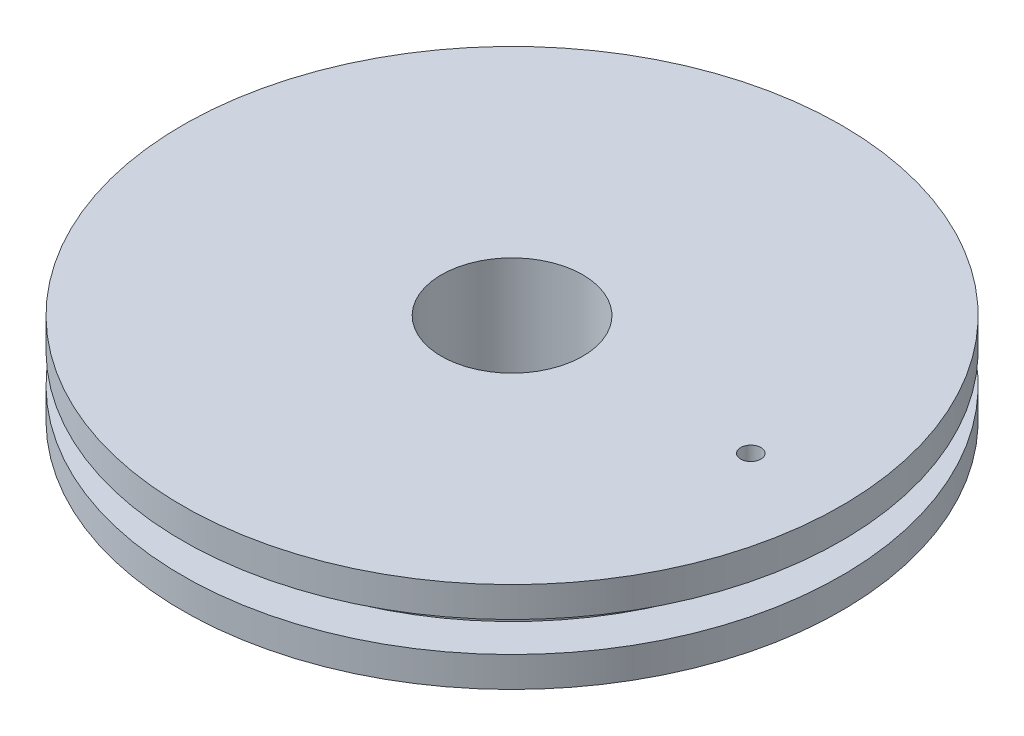
ISO-10303-21;
HEADER;
FILE_DESCRIPTION(('STEP AP214'),'2;1');
FILE_NAME('part.step','',(''),(''),'','','');
FILE_SCHEMA(('AUTOMOTIVE_DESIGN { 1 0 10303 214 1 1 1 1 }'));
ENDSEC;
DATA;
#1=APPLICATION_CONTEXT('core data for automotive mechanical design processes');
#2=APPLICATION_PROTOCOL_DEFINITION('international standard','automotive_design',2000,#1);
#3=PRODUCT_CONTEXT('',#1,'mechanical');
#4=PRODUCT('Part','Part','',(#3));
#5=PRODUCT_RELATED_PRODUCT_CATEGORY('part','',(#4));
#6=PRODUCT_DEFINITION_FORMATION('','',#4);
#7=PRODUCT_DEFINITION_CONTEXT('part definition',#1,'design');
#8=PRODUCT_DEFINITION('design','',#6,#7);
#9=PRODUCT_DEFINITION_SHAPE('','',#8);
#10=(LENGTH_UNIT() NAMED_UNIT(*) SI_UNIT(.MILLI.,.METRE.));
#11=(NAMED_UNIT(*) PLANE_ANGLE_UNIT() SI_UNIT($,.RADIAN.));
#12=(NAMED_UNIT(*) SI_UNIT($,.STERADIAN.) SOLID_ANGLE_UNIT());
#13=UNCERTAINTY_MEASURE_WITH_UNIT(LENGTH_MEASURE(1.E-05),#10,'distance_accuracy_value','');
#14=(GEOMETRIC_REPRESENTATION_CONTEXT(3) GLOBAL_UNCERTAINTY_ASSIGNED_CONTEXT((#13)) GLOBAL_UNIT_ASSIGNED_CONTEXT((#10,
#11,#12)) REPRESENTATION_CONTEXT('',''));
#15=CARTESIAN_POINT('',(0.,0.,0.));
#16=DIRECTION('',(0.,0.,1.));
#17=DIRECTION('',(1.,0.,0.));
#18=AXIS2_PLACEMENT_3D('',#15,#16,#17);
#19=CARTESIAN_POINT('',(0.,0.,0.));
#20=DIRECTION('',(0.,-1.,0.));
#21=DIRECTION('',(0.,0.,-1.));
#22=AXIS2_PLACEMENT_3D('',#19,#20,#21);
#23=CYLINDRICAL_SURFACE('',#22,32.65);
#24=CARTESIAN_POINT('',(0.,-1.5,0.));
#25=DIRECTION('',(0.,-1.,0.));
#26=DIRECTION('',(0.,0.,-1.));
#27=AXIS2_PLACEMENT_3D('',#24,#25,#26);
#28=CIRCLE('',#27,32.65);
#29=CARTESIAN_POINT('',(0.,-1.5,-32.65));
#30=VERTEX_POINT('',#29);
#31=EDGE_CURVE('E10',#30,#30,#28,.T.);
#32=ORIENTED_EDGE('',*,*,#31,.T.);
#33=EDGE_LOOP('',(#32));
#34=FACE_BOUND('',#33,.T.);
#35=CARTESIAN_POINT('',(0.,-4.5,0.));
#36=DIRECTION('',(0.,-1.,0.));
#37=DIRECTION('',(0.,0.,-1.));
#38=AXIS2_PLACEMENT_3D('',#35,#36,#37);
#39=CIRCLE('',#38,32.65);
#40=CARTESIAN_POINT('',(0.,-4.5,-32.65));
#41=VERTEX_POINT('',#40);
#42=EDGE_CURVE('E67',#41,#41,#39,.T.);
#43=ORIENTED_EDGE('',*,*,#42,.F.);
#44=EDGE_LOOP('',(#43));
#45=FACE_BOUND('',#44,.T.);
#46=ADVANCED_FACE('F33',(#34,#45),#23,.T.);
#47=CARTESIAN_POINT('',(32.65,-1.5,0.));
#48=DIRECTION('',(0.,1.,0.));
#49=DIRECTION('',(0.,0.,1.));
#50=AXIS2_PLACEMENT_3D('',#47,#48,#49);
#51=PLANE('',#50);
#52=CARTESIAN_POINT('',(0.,-1.5,0.));
#53=DIRECTION('',(0.,-1.,0.));
#54=DIRECTION('',(0.,0.,-1.));
#55=AXIS2_PLACEMENT_3D('',#52,#53,#54);
#56=CIRCLE('',#55,28.65);
#57=CARTESIAN_POINT('',(0.,-1.5,-28.65));
#58=VERTEX_POINT('',#57);
#59=EDGE_CURVE('E40',#58,#58,#56,.T.);
#60=ORIENTED_EDGE('',*,*,#59,.T.);
#61=EDGE_LOOP('',(#60));
#62=FACE_BOUND('',#61,.T.);
#63=ORIENTED_EDGE('',*,*,#31,.F.);
#64=EDGE_LOOP('',(#63));
#65=FACE_BOUND('',#64,.T.);
#66=ADVANCED_FACE('F127',(#62,#65),#51,.T.);
#67=CARTESIAN_POINT('',(0.,0.,0.));
#68=DIRECTION('',(0.,-1.,0.));
#69=DIRECTION('',(0.,0.,-1.));
#70=AXIS2_PLACEMENT_3D('',#67,#68,#69);
#71=CYLINDRICAL_SURFACE('',#70,28.65);
#72=CARTESIAN_POINT('',(0.,1.5,0.));
#73=DIRECTION('',(0.,-1.,0.));
#74=DIRECTION('',(0.,0.,-1.));
#75=AXIS2_PLACEMENT_3D('',#72,#73,#74);
#76=CIRCLE('',#75,28.65);
#77=CARTESIAN_POINT('',(0.,1.5,-28.65));
#78=VERTEX_POINT('',#77);
#79=EDGE_CURVE('E44',#78,#78,#76,.T.);
#80=ORIENTED_EDGE('',*,*,#79,.T.);
#81=EDGE_LOOP('',(#80));
#82=FACE_BOUND('',#81,.T.);
#83=ORIENTED_EDGE('',*,*,#59,.F.);
#84=EDGE_LOOP('',(#83));
#85=FACE_BOUND('',#84,.T.);
#86=ADVANCED_FACE('F121',(#82,#85),#71,.T.);
#87=CARTESIAN_POINT('',(32.65,1.5,0.));
#88=DIRECTION('',(0.,-1.,0.));
#89=DIRECTION('',(0.,0.,-1.));
#90=AXIS2_PLACEMENT_3D('',#87,#88,#89);
#91=PLANE('',#90);
#92=CARTESIAN_POINT('',(0.,1.5,0.));
#93=DIRECTION('',(0.,-1.,0.));
#94=DIRECTION('',(0.,0.,-1.));
#95=AXIS2_PLACEMENT_3D('',#92,#93,#94);
#96=CIRCLE('',#95,32.65);
#97=CARTESIAN_POINT('',(0.,1.5,-32.65));
#98=VERTEX_POINT('',#97);
#99=EDGE_CURVE('E49',#98,#98,#96,.T.);
#100=ORIENTED_EDGE('',*,*,#99,.T.);
#101=EDGE_LOOP('',(#100));
#102=FACE_BOUND('',#101,.T.);
#103=ORIENTED_EDGE('',*,*,#79,.F.);
#104=EDGE_LOOP('',(#103));
#105=FACE_BOUND('',#104,.T.);
#106=ADVANCED_FACE('F115',(#102,#105),#91,.T.);
#107=CARTESIAN_POINT('',(0.,0.,0.));
#108=DIRECTION('',(0.,-1.,0.));
#109=DIRECTION('',(0.,0.,-1.));
#110=AXIS2_PLACEMENT_3D('',#107,#108,#109);
#111=CYLINDRICAL_SURFACE('',#110,32.65);
#112=CARTESIAN_POINT('',(0.,4.5,0.));
#113=DIRECTION('',(0.,-1.,0.));
#114=DIRECTION('',(0.,0.,-1.));
#115=AXIS2_PLACEMENT_3D('',#112,#113,#114);
#116=CIRCLE('',#115,32.65);
#117=CARTESIAN_POINT('',(0.,4.5,-32.65));
#118=VERTEX_POINT('',#117);
#119=EDGE_CURVE('E52',#118,#118,#116,.T.);
#120=ORIENTED_EDGE('',*,*,#119,.T.);
#121=EDGE_LOOP('',(#120));
#122=FACE_BOUND('',#121,.T.);
#123=ORIENTED_EDGE('',*,*,#99,.F.);
#124=EDGE_LOOP('',(#123));
#125=FACE_BOUND('',#124,.T.);
#126=ADVANCED_FACE('F108',(#122,#125),#111,.T.);
#127=CARTESIAN_POINT('',(7.,4.5,0.));
#128=DIRECTION('',(0.,1.,0.));
#129=DIRECTION('',(0.,0.,1.));
#130=AXIS2_PLACEMENT_3D('',#127,#128,#129);
#131=PLANE('',#130);
#132=CARTESIAN_POINT('',(23.65,4.5,0.));
#133=DIRECTION('',(0.,1.,0.));
#134=DIRECTION('',(0.,0.,1.));
#135=AXIS2_PLACEMENT_3D('',#132,#133,#134);
#136=CIRCLE('',#135,1.);
#137=CARTESIAN_POINT('',(23.65,4.5,1.));
#138=VERTEX_POINT('',#137);
#139=EDGE_CURVE('E70',#138,#138,#136,.T.);
#140=ORIENTED_EDGE('',*,*,#139,.F.);
#141=EDGE_LOOP('',(#140));
#142=FACE_BOUND('',#141,.T.);
#143=CARTESIAN_POINT('',(0.,4.5,0.));
#144=DIRECTION('',(0.,-1.,0.));
#145=DIRECTION('',(0.,0.,-1.));
#146=AXIS2_PLACEMENT_3D('',#143,#144,#145);
#147=CIRCLE('',#146,7.);
#148=CARTESIAN_POINT('',(0.,4.5,-7.));
#149=VERTEX_POINT('',#148);
#150=EDGE_CURVE('E55',#149,#149,#147,.T.);
#151=ORIENTED_EDGE('',*,*,#150,.T.);
#152=EDGE_LOOP('',(#151));
#153=FACE_BOUND('',#152,.T.);
#154=ORIENTED_EDGE('',*,*,#119,.F.);
#155=EDGE_LOOP('',(#154));
#156=FACE_BOUND('',#155,.T.);
#157=ADVANCED_FACE('F102',(#142,#153,#156),#131,.T.);
#158=CARTESIAN_POINT('',(0.,0.,0.));
#159=DIRECTION('',(0.,-1.,0.));
#160=DIRECTION('',(0.,0.,-1.));
#161=AXIS2_PLACEMENT_3D('',#158,#159,#160);
#162=CYLINDRICAL_SURFACE('',#161,7.);
#163=CARTESIAN_POINT('',(0.,-17.5,0.));
#164=DIRECTION('',(0.,-1.,0.));
#165=DIRECTION('',(0.,0.,-1.));
#166=AXIS2_PLACEMENT_3D('',#163,#164,#165);
#167=CIRCLE('',#166,7.);
#168=CARTESIAN_POINT('',(0.,-17.5,-7.));
#169=VERTEX_POINT('',#168);
#170=EDGE_CURVE('E58',#169,#169,#167,.T.);
#171=ORIENTED_EDGE('',*,*,#170,.T.);
#172=EDGE_LOOP('',(#171));
#173=FACE_BOUND('',#172,.T.);
#174=ORIENTED_EDGE('',*,*,#150,.F.);
#175=EDGE_LOOP('',(#174));
#176=FACE_BOUND('',#175,.T.);
#177=ADVANCED_FACE('F96',(#173,#176),#162,.F.);
#178=CARTESIAN_POINT('',(7.,-17.5,0.));
#179=DIRECTION('',(0.,-1.,0.));
#180=DIRECTION('',(0.,0.,-1.));
#181=AXIS2_PLACEMENT_3D('',#178,#179,#180);
#182=PLANE('',#181);
#183=CARTESIAN_POINT('',(0.,-17.5,0.));
#184=DIRECTION('',(0.,-1.,0.));
#185=DIRECTION('',(0.,0.,-1.));
#186=AXIS2_PLACEMENT_3D('',#183,#184,#185);
#187=CIRCLE('',#186,10.);
#188=CARTESIAN_POINT('',(0.,-17.5,-10.));
#189=VERTEX_POINT('',#188);
#190=EDGE_CURVE('E61',#189,#189,#187,.T.);
#191=ORIENTED_EDGE('',*,*,#190,.T.);
#192=EDGE_LOOP('',(#191));
#193=FACE_BOUND('',#192,.T.);
#194=ORIENTED_EDGE('',*,*,#170,.F.);
#195=EDGE_LOOP('',(#194));
#196=FACE_BOUND('',#195,.T.);
#197=ADVANCED_FACE('F90',(#193,#196),#182,.T.);
#198=CARTESIAN_POINT('',(0.,0.,0.));
#199=DIRECTION('',(0.,-1.,0.));
#200=DIRECTION('',(0.,0.,-1.));
#201=AXIS2_PLACEMENT_3D('',#198,#199,#200);
#202=CYLINDRICAL_SURFACE('',#201,10.);
#203=CARTESIAN_POINT('',(0.,-4.5,0.));
#204=DIRECTION('',(0.,-1.,0.));
#205=DIRECTION('',(0.,0.,-1.));
#206=AXIS2_PLACEMENT_3D('',#203,#204,#205);
#207=CIRCLE('',#206,10.);
#208=CARTESIAN_POINT('',(0.,-4.5,-10.));
#209=VERTEX_POINT('',#208);
#210=EDGE_CURVE('E64',#209,#209,#207,.T.);
#211=ORIENTED_EDGE('',*,*,#210,.T.);
#212=EDGE_LOOP('',(#211));
#213=FACE_BOUND('',#212,.T.);
#214=ORIENTED_EDGE('',*,*,#190,.F.);
#215=EDGE_LOOP('',(#214));
#216=FACE_BOUND('',#215,.T.);
#217=ADVANCED_FACE('F82',(#213,#216),#202,.T.);
#218=CARTESIAN_POINT('',(32.65,-4.5,0.));
#219=DIRECTION('',(0.,-1.,0.));
#220=DIRECTION('',(0.,0.,-1.));
#221=AXIS2_PLACEMENT_3D('',#218,#219,#220);
#222=PLANE('',#221);
#223=CARTESIAN_POINT('',(23.65,-4.5,0.));
#224=DIRECTION('',(0.,-1.,0.));
#225=DIRECTION('',(0.,0.,-1.));
#226=AXIS2_PLACEMENT_3D('',#223,#224,#225);
#227=CIRCLE('',#226,1.);
#228=CARTESIAN_POINT('',(23.65,-4.5,-1.));
#229=VERTEX_POINT('',#228);
#230=EDGE_CURVE('E36',#229,#229,#227,.T.);
#231=ORIENTED_EDGE('',*,*,#230,.F.);
#232=EDGE_LOOP('',(#231));
#233=FACE_BOUND('',#232,.T.);
#234=ORIENTED_EDGE('',*,*,#42,.T.);
#235=EDGE_LOOP('',(#234));
#236=FACE_BOUND('',#235,.T.);
#237=ORIENTED_EDGE('',*,*,#210,.F.);
#238=EDGE_LOOP('',(#237));
#239=FACE_BOUND('',#238,.T.);
#240=ADVANCED_FACE('F79',(#233,#236,#239),#222,.T.);
#241=CARTESIAN_POINT('',(23.65,-17.5,0.));
#242=DIRECTION('',(0.,1.,0.));
#243=DIRECTION('',(0.,0.,1.));
#244=AXIS2_PLACEMENT_3D('',#241,#242,#243);
#245=CYLINDRICAL_SURFACE('',#244,1.);
#246=ORIENTED_EDGE('',*,*,#230,.T.);
#247=EDGE_LOOP('',(#246));
#248=FACE_BOUND('',#247,.T.);
#249=ORIENTED_EDGE('',*,*,#139,.T.);
#250=EDGE_LOOP('',(#249));
#251=FACE_BOUND('',#250,.T.);
#252=ADVANCED_FACE('F77',(#248,#251),#245,.F.);
#253=CLOSED_SHELL('',(#46,#66,#86,#106,#126,#157,#177,#197,#217,#240,#252));
#254=MANIFOLD_SOLID_BREP('B2',#253);
#255=ADVANCED_BREP_SHAPE_REPRESENTATION('',(#18,#254),#14);
#256=SHAPE_DEFINITION_REPRESENTATION(#9,#255);
ENDSEC;
END-ISO-10303-21;
